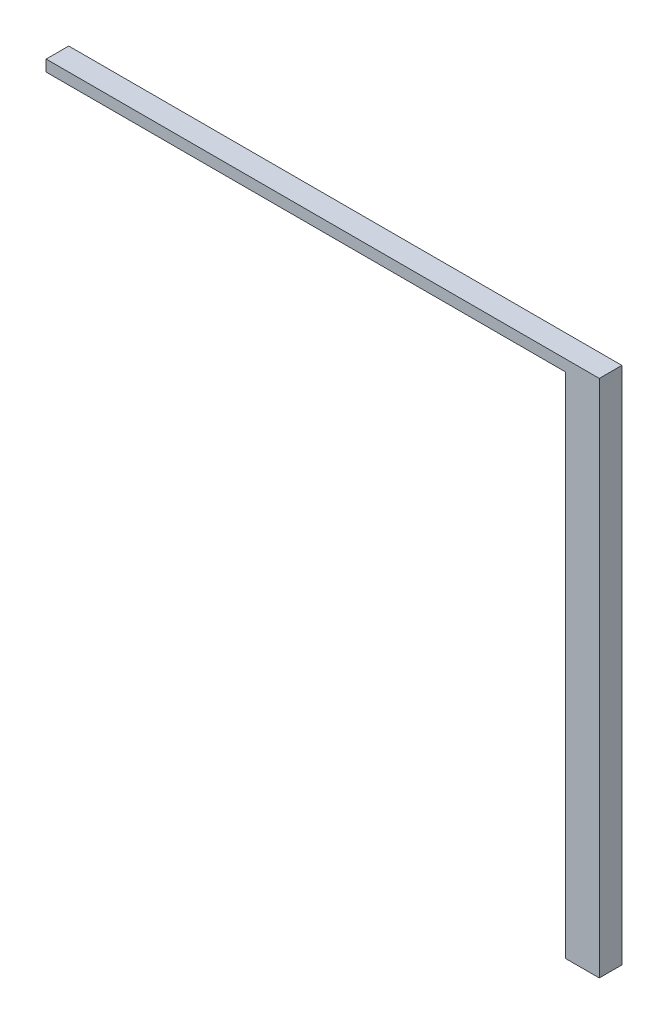
ISO-10303-21;
HEADER;
FILE_DESCRIPTION(('STEP AP214'),'2;1');
FILE_NAME('part.step','',(''),(''),'','','');
FILE_SCHEMA(('AUTOMOTIVE_DESIGN { 1 0 10303 214 1 1 1 1 }'));
ENDSEC;
DATA;
#1=APPLICATION_CONTEXT('core data for automotive mechanical design processes');
#2=APPLICATION_PROTOCOL_DEFINITION('international standard','automotive_design',2000,#1);
#3=PRODUCT_CONTEXT('',#1,'mechanical');
#4=PRODUCT('Part','Part','',(#3));
#5=PRODUCT_RELATED_PRODUCT_CATEGORY('part','',(#4));
#6=PRODUCT_DEFINITION_FORMATION('','',#4);
#7=PRODUCT_DEFINITION_CONTEXT('part definition',#1,'design');
#8=PRODUCT_DEFINITION('design','',#6,#7);
#9=PRODUCT_DEFINITION_SHAPE('','',#8);
#10=(LENGTH_UNIT() NAMED_UNIT(*) SI_UNIT(.MILLI.,.METRE.));
#11=(NAMED_UNIT(*) PLANE_ANGLE_UNIT() SI_UNIT($,.RADIAN.));
#12=(NAMED_UNIT(*) SI_UNIT($,.STERADIAN.) SOLID_ANGLE_UNIT());
#13=UNCERTAINTY_MEASURE_WITH_UNIT(LENGTH_MEASURE(1.E-05),#10,'distance_accuracy_value','');
#14=(GEOMETRIC_REPRESENTATION_CONTEXT(3) GLOBAL_UNCERTAINTY_ASSIGNED_CONTEXT((#13)) GLOBAL_UNIT_ASSIGNED_CONTEXT((#10,
#11,#12)) REPRESENTATION_CONTEXT('',''));
#15=CARTESIAN_POINT('',(0.,0.,0.));
#16=DIRECTION('',(0.,0.,1.));
#17=DIRECTION('',(1.,0.,0.));
#18=AXIS2_PLACEMENT_3D('',#15,#16,#17);
#19=CARTESIAN_POINT('',(-30.,460.,0.));
#20=DIRECTION('',(1.,0.,0.));
#21=DIRECTION('',(0.,0.,-1.));
#22=AXIS2_PLACEMENT_3D('',#19,#20,#21);
#23=PLANE('',#22);
#24=DIRECTION('',(0.,0.,1.));
#25=VECTOR('',#24,1.);
#26=CARTESIAN_POINT('',(-30.,450.,0.));
#27=LINE('',#26,#25);
#28=CARTESIAN_POINT('',(-30.,450.,-20.));
#29=VERTEX_POINT('',#28);
#30=CARTESIAN_POINT('',(-30.,450.,0.));
#31=VERTEX_POINT('',#30);
#32=EDGE_CURVE('E50',#29,#31,#27,.T.);
#33=ORIENTED_EDGE('',*,*,#32,.F.);
#34=DIRECTION('',(0.,-1.,0.));
#35=VECTOR('',#34,1.);
#36=CARTESIAN_POINT('',(-30.,460.,-20.));
#37=LINE('',#36,#35);
#38=CARTESIAN_POINT('',(-30.,0.,-20.));
#39=VERTEX_POINT('',#38);
#40=EDGE_CURVE('E43',#29,#39,#37,.T.);
#41=ORIENTED_EDGE('',*,*,#40,.T.);
#42=DIRECTION('',(0.,0.,1.));
#43=VECTOR('',#42,1.);
#44=CARTESIAN_POINT('',(-30.,0.,0.));
#45=LINE('',#44,#43);
#46=CARTESIAN_POINT('',(-30.,0.,0.));
#47=VERTEX_POINT('',#46);
#48=EDGE_CURVE('E89',#39,#47,#45,.T.);
#49=ORIENTED_EDGE('',*,*,#48,.T.);
#50=DIRECTION('',(0.,-1.,0.));
#51=VECTOR('',#50,1.);
#52=CARTESIAN_POINT('',(-30.,460.,0.));
#53=LINE('',#52,#51);
#54=EDGE_CURVE('E83',#31,#47,#53,.T.);
#55=ORIENTED_EDGE('',*,*,#54,.F.);
#56=EDGE_LOOP('',(#33,#41,#49,#55));
#57=FACE_BOUND('',#56,.T.);
#58=ADVANCED_FACE('F35',(#57),#23,.F.);
#59=CARTESIAN_POINT('',(0.,460.,0.));
#60=DIRECTION('',(-1.,0.,0.));
#61=DIRECTION('',(0.,0.,1.));
#62=AXIS2_PLACEMENT_3D('',#59,#60,#61);
#63=PLANE('',#62);
#64=DIRECTION('',(0.,0.,-1.));
#65=VECTOR('',#64,1.);
#66=CARTESIAN_POINT('',(0.,0.,0.));
#67=LINE('',#66,#65);
#68=CARTESIAN_POINT('',(0.,0.,0.));
#69=VERTEX_POINT('',#68);
#70=CARTESIAN_POINT('',(0.,0.,-20.));
#71=VERTEX_POINT('',#70);
#72=EDGE_CURVE('E94',#69,#71,#67,.T.);
#73=ORIENTED_EDGE('',*,*,#72,.T.);
#74=DIRECTION('',(0.,-1.,0.));
#75=VECTOR('',#74,1.);
#76=CARTESIAN_POINT('',(0.,460.,-20.));
#77=LINE('',#76,#75);
#78=CARTESIAN_POINT('',(0.,460.,-20.));
#79=VERTEX_POINT('',#78);
#80=EDGE_CURVE('E11',#79,#71,#77,.T.);
#81=ORIENTED_EDGE('',*,*,#80,.F.);
#82=DIRECTION('',(0.,0.,-1.));
#83=VECTOR('',#82,1.);
#84=CARTESIAN_POINT('',(0.,460.,0.));
#85=LINE('',#84,#83);
#86=CARTESIAN_POINT('',(0.,460.,0.));
#87=VERTEX_POINT('',#86);
#88=EDGE_CURVE('E88',#87,#79,#85,.T.);
#89=ORIENTED_EDGE('',*,*,#88,.F.);
#90=DIRECTION('',(0.,-1.,0.));
#91=VECTOR('',#90,1.);
#92=CARTESIAN_POINT('',(0.,460.,0.));
#93=LINE('',#92,#91);
#94=EDGE_CURVE('E80',#87,#69,#93,.T.);
#95=ORIENTED_EDGE('',*,*,#94,.T.);
#96=EDGE_LOOP('',(#73,#81,#89,#95));
#97=FACE_BOUND('',#96,.T.);
#98=ADVANCED_FACE('F37',(#97),#63,.F.);
#99=CARTESIAN_POINT('',(0.,460.,-20.));
#100=DIRECTION('',(0.,0.,1.));
#101=DIRECTION('',(1.,0.,0.));
#102=AXIS2_PLACEMENT_3D('',#99,#100,#101);
#103=PLANE('',#102);
#104=DIRECTION('',(-1.,0.,0.));
#105=VECTOR('',#104,1.);
#106=CARTESIAN_POINT('',(0.,0.,-20.));
#107=LINE('',#106,#105);
#108=EDGE_CURVE('E98',#71,#39,#107,.T.);
#109=ORIENTED_EDGE('',*,*,#108,.T.);
#110=ORIENTED_EDGE('',*,*,#40,.F.);
#111=DIRECTION('',(1.,0.,0.));
#112=VECTOR('',#111,1.);
#113=CARTESIAN_POINT('',(-490.,450.,-20.));
#114=LINE('',#113,#112);
#115=CARTESIAN_POINT('',(-490.,450.,-20.));
#116=VERTEX_POINT('',#115);
#117=EDGE_CURVE('E99',#116,#29,#114,.T.);
#118=ORIENTED_EDGE('',*,*,#117,.F.);
#119=DIRECTION('',(0.,-1.,0.));
#120=VECTOR('',#119,1.);
#121=CARTESIAN_POINT('',(-490.,460.,-20.));
#122=LINE('',#121,#120);
#123=CARTESIAN_POINT('',(-490.,460.,-20.));
#124=VERTEX_POINT('',#123);
#125=EDGE_CURVE('E117',#124,#116,#122,.T.);
#126=ORIENTED_EDGE('',*,*,#125,.F.);
#127=DIRECTION('',(-1.,0.,0.));
#128=VECTOR('',#127,1.);
#129=CARTESIAN_POINT('',(0.,460.,-20.));
#130=LINE('',#129,#128);
#131=EDGE_CURVE('E114',#79,#124,#130,.T.);
#132=ORIENTED_EDGE('',*,*,#131,.F.);
#133=ORIENTED_EDGE('',*,*,#80,.T.);
#134=EDGE_LOOP('',(#109,#110,#118,#126,#132,#133));
#135=FACE_BOUND('',#134,.T.);
#136=ADVANCED_FACE('F111',(#135),#103,.F.);
#137=CARTESIAN_POINT('',(0.,460.,0.));
#138=DIRECTION('',(0.,0.,-1.));
#139=DIRECTION('',(-1.,0.,0.));
#140=AXIS2_PLACEMENT_3D('',#137,#138,#139);
#141=PLANE('',#140);
#142=DIRECTION('',(1.,0.,0.));
#143=VECTOR('',#142,1.);
#144=CARTESIAN_POINT('',(0.,0.,0.));
#145=LINE('',#144,#143);
#146=EDGE_CURVE('E77',#47,#69,#145,.T.);
#147=ORIENTED_EDGE('',*,*,#146,.T.);
#148=ORIENTED_EDGE('',*,*,#94,.F.);
#149=DIRECTION('',(1.,0.,0.));
#150=VECTOR('',#149,1.);
#151=CARTESIAN_POINT('',(0.,460.,0.));
#152=LINE('',#151,#150);
#153=CARTESIAN_POINT('',(-490.,460.,0.));
#154=VERTEX_POINT('',#153);
#155=EDGE_CURVE('E59',#154,#87,#152,.T.);
#156=ORIENTED_EDGE('',*,*,#155,.F.);
#157=DIRECTION('',(0.,1.,0.));
#158=VECTOR('',#157,1.);
#159=CARTESIAN_POINT('',(-490.,460.,0.));
#160=LINE('',#159,#158);
#161=CARTESIAN_POINT('',(-490.,450.,0.));
#162=VERTEX_POINT('',#161);
#163=EDGE_CURVE('E125',#162,#154,#160,.T.);
#164=ORIENTED_EDGE('',*,*,#163,.F.);
#165=DIRECTION('',(1.,0.,0.));
#166=VECTOR('',#165,1.);
#167=CARTESIAN_POINT('',(-490.,450.,0.));
#168=LINE('',#167,#166);
#169=EDGE_CURVE('E103',#162,#31,#168,.T.);
#170=ORIENTED_EDGE('',*,*,#169,.T.);
#171=ORIENTED_EDGE('',*,*,#54,.T.);
#172=EDGE_LOOP('',(#147,#148,#156,#164,#170,#171));
#173=FACE_BOUND('',#172,.T.);
#174=ADVANCED_FACE('F79',(#173),#141,.F.);
#175=CARTESIAN_POINT('',(0.,460.,0.));
#176=DIRECTION('',(0.,1.,0.));
#177=DIRECTION('',(0.,0.,1.));
#178=AXIS2_PLACEMENT_3D('',#175,#176,#177);
#179=PLANE('',#178);
#180=ORIENTED_EDGE('',*,*,#88,.T.);
#181=ORIENTED_EDGE('',*,*,#131,.T.);
#182=DIRECTION('',(0.,0.,-1.));
#183=VECTOR('',#182,1.);
#184=CARTESIAN_POINT('',(-490.,460.,0.));
#185=LINE('',#184,#183);
#186=EDGE_CURVE('E129',#154,#124,#185,.T.);
#187=ORIENTED_EDGE('',*,*,#186,.F.);
#188=ORIENTED_EDGE('',*,*,#155,.T.);
#189=EDGE_LOOP('',(#180,#181,#187,#188));
#190=FACE_BOUND('',#189,.T.);
#191=ADVANCED_FACE('F119',(#190),#179,.T.);
#192=CARTESIAN_POINT('',(0.,0.,0.));
#193=DIRECTION('',(0.,1.,0.));
#194=DIRECTION('',(0.,0.,1.));
#195=AXIS2_PLACEMENT_3D('',#192,#193,#194);
#196=PLANE('',#195);
#197=ORIENTED_EDGE('',*,*,#72,.F.);
#198=ORIENTED_EDGE('',*,*,#146,.F.);
#199=ORIENTED_EDGE('',*,*,#48,.F.);
#200=ORIENTED_EDGE('',*,*,#108,.F.);
#201=EDGE_LOOP('',(#197,#198,#199,#200));
#202=FACE_BOUND('',#201,.T.);
#203=ADVANCED_FACE('F96',(#202),#196,.F.);
#204=CARTESIAN_POINT('',(-490.,450.,0.));
#205=DIRECTION('',(0.,1.,0.));
#206=DIRECTION('',(0.,0.,1.));
#207=AXIS2_PLACEMENT_3D('',#204,#205,#206);
#208=PLANE('',#207);
#209=ORIENTED_EDGE('',*,*,#32,.T.);
#210=ORIENTED_EDGE('',*,*,#169,.F.);
#211=DIRECTION('',(0.,0.,1.));
#212=VECTOR('',#211,1.);
#213=CARTESIAN_POINT('',(-490.,450.,0.));
#214=LINE('',#213,#212);
#215=EDGE_CURVE('E123',#116,#162,#214,.T.);
#216=ORIENTED_EDGE('',*,*,#215,.F.);
#217=ORIENTED_EDGE('',*,*,#117,.T.);
#218=EDGE_LOOP('',(#209,#210,#216,#217));
#219=FACE_BOUND('',#218,.T.);
#220=ADVANCED_FACE('F145',(#219),#208,.F.);
#221=CARTESIAN_POINT('',(-490.,0.,0.));
#222=DIRECTION('',(1.,0.,0.));
#223=DIRECTION('',(0.,0.,-1.));
#224=AXIS2_PLACEMENT_3D('',#221,#222,#223);
#225=PLANE('',#224);
#226=ORIENTED_EDGE('',*,*,#163,.T.);
#227=ORIENTED_EDGE('',*,*,#186,.T.);
#228=ORIENTED_EDGE('',*,*,#125,.T.);
#229=ORIENTED_EDGE('',*,*,#215,.T.);
#230=EDGE_LOOP('',(#226,#227,#228,#229));
#231=FACE_BOUND('',#230,.T.);
#232=ADVANCED_FACE('F135',(#231),#225,.F.);
#233=CLOSED_SHELL('',(#58,#98,#136,#174,#191,#203,#220,#232));
#234=MANIFOLD_SOLID_BREP('B2',#233);
#235=ADVANCED_BREP_SHAPE_REPRESENTATION('',(#18,#234),#14);
#236=SHAPE_DEFINITION_REPRESENTATION(#9,#235);
ENDSEC;
END-ISO-10303-21;
